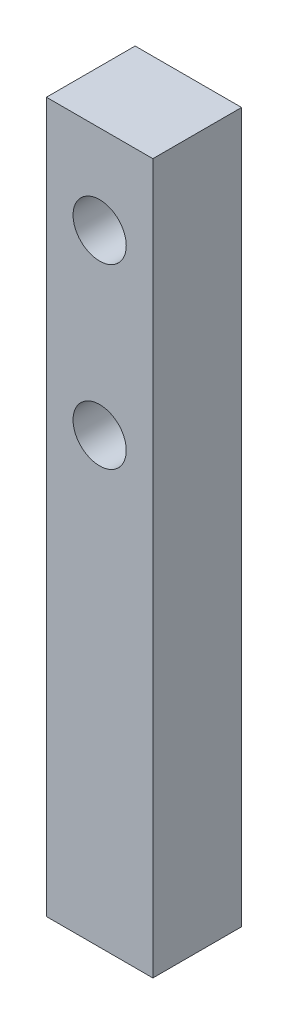
ISO-10303-21;
HEADER;
FILE_DESCRIPTION(('STEP AP214'),'2;1');
FILE_NAME('part.step','',(''),(''),'','','');
FILE_SCHEMA(('AUTOMOTIVE_DESIGN { 1 0 10303 214 1 1 1 1 }'));
ENDSEC;
DATA;
#1=APPLICATION_CONTEXT('core data for automotive mechanical design processes');
#2=APPLICATION_PROTOCOL_DEFINITION('international standard','automotive_design',2000,#1);
#3=PRODUCT_CONTEXT('',#1,'mechanical');
#4=PRODUCT('Part','Part','',(#3));
#5=PRODUCT_RELATED_PRODUCT_CATEGORY('part','',(#4));
#6=PRODUCT_DEFINITION_FORMATION('','',#4);
#7=PRODUCT_DEFINITION_CONTEXT('part definition',#1,'design');
#8=PRODUCT_DEFINITION('design','',#6,#7);
#9=PRODUCT_DEFINITION_SHAPE('','',#8);
#10=(LENGTH_UNIT() NAMED_UNIT(*) SI_UNIT(.MILLI.,.METRE.));
#11=(NAMED_UNIT(*) PLANE_ANGLE_UNIT() SI_UNIT($,.RADIAN.));
#12=(NAMED_UNIT(*) SI_UNIT($,.STERADIAN.) SOLID_ANGLE_UNIT());
#13=UNCERTAINTY_MEASURE_WITH_UNIT(LENGTH_MEASURE(1.E-05),#10,'distance_accuracy_value','');
#14=(GEOMETRIC_REPRESENTATION_CONTEXT(3) GLOBAL_UNCERTAINTY_ASSIGNED_CONTEXT((#13)) GLOBAL_UNIT_ASSIGNED_CONTEXT((#10,
#11,#12)) REPRESENTATION_CONTEXT('',''));
#15=CARTESIAN_POINT('',(0.,0.,0.));
#16=DIRECTION('',(0.,0.,1.));
#17=DIRECTION('',(1.,0.,0.));
#18=AXIS2_PLACEMENT_3D('',#15,#16,#17);
#19=CARTESIAN_POINT('',(0.,0.,6.35));
#20=DIRECTION('',(0.,0.,-1.));
#21=DIRECTION('',(-1.,0.,0.));
#22=AXIS2_PLACEMENT_3D('',#19,#20,#21);
#23=PLANE('',#22);
#24=DIRECTION('',(0.,-1.,0.));
#25=VECTOR('',#24,1.);
#26=CARTESIAN_POINT('',(0.,0.,6.35));
#27=LINE('',#26,#25);
#28=CARTESIAN_POINT('',(0.,50.8,6.35));
#29=VERTEX_POINT('',#28);
#30=CARTESIAN_POINT('',(0.,0.,6.35));
#31=VERTEX_POINT('',#30);
#32=EDGE_CURVE('E88',#29,#31,#27,.T.);
#33=ORIENTED_EDGE('',*,*,#32,.T.);
#34=DIRECTION('',(1.,0.,0.));
#35=VECTOR('',#34,1.);
#36=CARTESIAN_POINT('',(0.,0.,6.35));
#37=LINE('',#36,#35);
#38=CARTESIAN_POINT('',(7.62,0.,6.35));
#39=VERTEX_POINT('',#38);
#40=EDGE_CURVE('E83',#31,#39,#37,.T.);
#41=ORIENTED_EDGE('',*,*,#40,.T.);
#42=DIRECTION('',(0.,1.,0.));
#43=VECTOR('',#42,1.);
#44=CARTESIAN_POINT('',(7.62,0.,6.35));
#45=LINE('',#44,#43);
#46=CARTESIAN_POINT('',(7.62,50.8,6.35));
#47=VERTEX_POINT('',#46);
#48=EDGE_CURVE('E86',#39,#47,#45,.T.);
#49=ORIENTED_EDGE('',*,*,#48,.T.);
#50=DIRECTION('',(-1.,0.,0.));
#51=VECTOR('',#50,1.);
#52=CARTESIAN_POINT('',(0.,50.8,6.35));
#53=LINE('',#52,#51);
#54=EDGE_CURVE('E53',#47,#29,#53,.T.);
#55=ORIENTED_EDGE('',*,*,#54,.T.);
#56=EDGE_LOOP('',(#33,#41,#49,#55));
#57=FACE_BOUND('',#56,.T.);
#58=CARTESIAN_POINT('',(3.81,44.45,6.35));
#59=DIRECTION('',(0.,0.,1.));
#60=DIRECTION('',(1.,0.,0.));
#61=AXIS2_PLACEMENT_3D('',#58,#59,#60);
#62=CIRCLE('',#61,1.905);
#63=CARTESIAN_POINT('',(5.715,44.45,6.35));
#64=VERTEX_POINT('',#63);
#65=EDGE_CURVE('E103',#64,#64,#62,.T.);
#66=ORIENTED_EDGE('',*,*,#65,.F.);
#67=EDGE_LOOP('',(#66));
#68=FACE_BOUND('',#67,.T.);
#69=CARTESIAN_POINT('',(3.81,31.75,6.35));
#70=DIRECTION('',(0.,0.,1.));
#71=DIRECTION('',(1.,0.,0.));
#72=AXIS2_PLACEMENT_3D('',#69,#70,#71);
#73=CIRCLE('',#72,1.905);
#74=CARTESIAN_POINT('',(5.715,31.75,6.35));
#75=VERTEX_POINT('',#74);
#76=EDGE_CURVE('E118',#75,#75,#73,.T.);
#77=ORIENTED_EDGE('',*,*,#76,.F.);
#78=EDGE_LOOP('',(#77));
#79=FACE_BOUND('',#78,.T.);
#80=ADVANCED_FACE('F36',(#57,#68,#79),#23,.F.);
#81=CARTESIAN_POINT('',(0.,0.,0.));
#82=DIRECTION('',(0.,0.,-1.));
#83=DIRECTION('',(-1.,0.,0.));
#84=AXIS2_PLACEMENT_3D('',#81,#82,#83);
#85=PLANE('',#84);
#86=CARTESIAN_POINT('',(3.81,44.45,0.));
#87=DIRECTION('',(0.,0.,1.));
#88=DIRECTION('',(1.,0.,0.));
#89=AXIS2_PLACEMENT_3D('',#86,#87,#88);
#90=CIRCLE('',#89,1.905);
#91=CARTESIAN_POINT('',(5.715,44.45,0.));
#92=VERTEX_POINT('',#91);
#93=EDGE_CURVE('E115',#92,#92,#90,.T.);
#94=ORIENTED_EDGE('',*,*,#93,.T.);
#95=EDGE_LOOP('',(#94));
#96=FACE_BOUND('',#95,.T.);
#97=DIRECTION('',(0.,-1.,0.));
#98=VECTOR('',#97,1.);
#99=CARTESIAN_POINT('',(0.,0.,0.));
#100=LINE('',#99,#98);
#101=CARTESIAN_POINT('',(0.,50.8,0.));
#102=VERTEX_POINT('',#101);
#103=CARTESIAN_POINT('',(0.,0.,0.));
#104=VERTEX_POINT('',#103);
#105=EDGE_CURVE('E100',#102,#104,#100,.T.);
#106=ORIENTED_EDGE('',*,*,#105,.F.);
#107=DIRECTION('',(-1.,0.,0.));
#108=VECTOR('',#107,1.);
#109=CARTESIAN_POINT('',(0.,50.8,0.));
#110=LINE('',#109,#108);
#111=CARTESIAN_POINT('',(7.62,50.8,0.));
#112=VERTEX_POINT('',#111);
#113=EDGE_CURVE('E76',#112,#102,#110,.T.);
#114=ORIENTED_EDGE('',*,*,#113,.F.);
#115=DIRECTION('',(0.,1.,0.));
#116=VECTOR('',#115,1.);
#117=CARTESIAN_POINT('',(7.62,0.,0.));
#118=LINE('',#117,#116);
#119=CARTESIAN_POINT('',(7.62,0.,0.));
#120=VERTEX_POINT('',#119);
#121=EDGE_CURVE('E70',#120,#112,#118,.T.);
#122=ORIENTED_EDGE('',*,*,#121,.F.);
#123=DIRECTION('',(1.,0.,0.));
#124=VECTOR('',#123,1.);
#125=CARTESIAN_POINT('',(0.,0.,0.));
#126=LINE('',#125,#124);
#127=EDGE_CURVE('E92',#104,#120,#126,.T.);
#128=ORIENTED_EDGE('',*,*,#127,.F.);
#129=EDGE_LOOP('',(#106,#114,#122,#128));
#130=FACE_BOUND('',#129,.T.);
#131=CARTESIAN_POINT('',(3.81,31.75,0.));
#132=DIRECTION('',(0.,0.,1.));
#133=DIRECTION('',(1.,0.,0.));
#134=AXIS2_PLACEMENT_3D('',#131,#132,#133);
#135=CIRCLE('',#134,1.905);
#136=CARTESIAN_POINT('',(5.715,31.75,0.));
#137=VERTEX_POINT('',#136);
#138=EDGE_CURVE('E121',#137,#137,#135,.T.);
#139=ORIENTED_EDGE('',*,*,#138,.T.);
#140=EDGE_LOOP('',(#139));
#141=FACE_BOUND('',#140,.T.);
#142=ADVANCED_FACE('F111',(#96,#130,#141),#85,.T.);
#143=CARTESIAN_POINT('',(0.,0.,6.35));
#144=DIRECTION('',(1.,0.,0.));
#145=DIRECTION('',(0.,0.,-1.));
#146=AXIS2_PLACEMENT_3D('',#143,#144,#145);
#147=PLANE('',#146);
#148=ORIENTED_EDGE('',*,*,#105,.T.);
#149=DIRECTION('',(0.,0.,-1.));
#150=VECTOR('',#149,1.);
#151=CARTESIAN_POINT('',(0.,0.,6.35));
#152=LINE('',#151,#150);
#153=EDGE_CURVE('E11',#31,#104,#152,.T.);
#154=ORIENTED_EDGE('',*,*,#153,.F.);
#155=ORIENTED_EDGE('',*,*,#32,.F.);
#156=DIRECTION('',(0.,0.,-1.));
#157=VECTOR('',#156,1.);
#158=CARTESIAN_POINT('',(0.,50.8,6.35));
#159=LINE('',#158,#157);
#160=EDGE_CURVE('E96',#29,#102,#159,.T.);
#161=ORIENTED_EDGE('',*,*,#160,.T.);
#162=EDGE_LOOP('',(#148,#154,#155,#161));
#163=FACE_BOUND('',#162,.T.);
#164=ADVANCED_FACE('F38',(#163),#147,.F.);
#165=CARTESIAN_POINT('',(0.,0.,6.35));
#166=DIRECTION('',(0.,1.,0.));
#167=DIRECTION('',(0.,0.,1.));
#168=AXIS2_PLACEMENT_3D('',#165,#166,#167);
#169=PLANE('',#168);
#170=ORIENTED_EDGE('',*,*,#127,.T.);
#171=DIRECTION('',(0.,0.,-1.));
#172=VECTOR('',#171,1.);
#173=CARTESIAN_POINT('',(7.62,0.,6.35));
#174=LINE('',#173,#172);
#175=EDGE_CURVE('E45',#39,#120,#174,.T.);
#176=ORIENTED_EDGE('',*,*,#175,.F.);
#177=ORIENTED_EDGE('',*,*,#40,.F.);
#178=ORIENTED_EDGE('',*,*,#153,.T.);
#179=EDGE_LOOP('',(#170,#176,#177,#178));
#180=FACE_BOUND('',#179,.T.);
#181=ADVANCED_FACE('F91',(#180),#169,.F.);
#182=CARTESIAN_POINT('',(7.62,0.,6.35));
#183=DIRECTION('',(-1.,0.,0.));
#184=DIRECTION('',(0.,0.,1.));
#185=AXIS2_PLACEMENT_3D('',#182,#183,#184);
#186=PLANE('',#185);
#187=ORIENTED_EDGE('',*,*,#121,.T.);
#188=DIRECTION('',(0.,0.,-1.));
#189=VECTOR('',#188,1.);
#190=CARTESIAN_POINT('',(7.62,50.8,6.35));
#191=LINE('',#190,#189);
#192=EDGE_CURVE('E93',#47,#112,#191,.T.);
#193=ORIENTED_EDGE('',*,*,#192,.F.);
#194=ORIENTED_EDGE('',*,*,#48,.F.);
#195=ORIENTED_EDGE('',*,*,#175,.T.);
#196=EDGE_LOOP('',(#187,#193,#194,#195));
#197=FACE_BOUND('',#196,.T.);
#198=ADVANCED_FACE('F94',(#197),#186,.F.);
#199=CARTESIAN_POINT('',(0.,50.8,6.35));
#200=DIRECTION('',(0.,-1.,0.));
#201=DIRECTION('',(0.,0.,-1.));
#202=AXIS2_PLACEMENT_3D('',#199,#200,#201);
#203=PLANE('',#202);
#204=ORIENTED_EDGE('',*,*,#113,.T.);
#205=ORIENTED_EDGE('',*,*,#160,.F.);
#206=ORIENTED_EDGE('',*,*,#54,.F.);
#207=ORIENTED_EDGE('',*,*,#192,.T.);
#208=EDGE_LOOP('',(#204,#205,#206,#207));
#209=FACE_BOUND('',#208,.T.);
#210=ADVANCED_FACE('F108',(#209),#203,.F.);
#211=CARTESIAN_POINT('',(3.81,44.45,6.35));
#212=DIRECTION('',(0.,0.,-1.));
#213=DIRECTION('',(-1.,0.,0.));
#214=AXIS2_PLACEMENT_3D('',#211,#212,#213);
#215=CYLINDRICAL_SURFACE('',#214,1.905);
#216=ORIENTED_EDGE('',*,*,#65,.T.);
#217=EDGE_LOOP('',(#216));
#218=FACE_BOUND('',#217,.T.);
#219=ORIENTED_EDGE('',*,*,#93,.F.);
#220=EDGE_LOOP('',(#219));
#221=FACE_BOUND('',#220,.T.);
#222=ADVANCED_FACE('F138',(#218,#221),#215,.F.);
#223=CARTESIAN_POINT('',(3.81,31.75,6.35));
#224=DIRECTION('',(0.,0.,-1.));
#225=DIRECTION('',(-1.,0.,0.));
#226=AXIS2_PLACEMENT_3D('',#223,#224,#225);
#227=CYLINDRICAL_SURFACE('',#226,1.905);
#228=ORIENTED_EDGE('',*,*,#76,.T.);
#229=EDGE_LOOP('',(#228));
#230=FACE_BOUND('',#229,.T.);
#231=ORIENTED_EDGE('',*,*,#138,.F.);
#232=EDGE_LOOP('',(#231));
#233=FACE_BOUND('',#232,.T.);
#234=ADVANCED_FACE('F127',(#230,#233),#227,.F.);
#235=CLOSED_SHELL('',(#80,#142,#164,#181,#198,#210,#222,#234));
#236=MANIFOLD_SOLID_BREP('B2',#235);
#237=ADVANCED_BREP_SHAPE_REPRESENTATION('',(#18,#236),#14);
#238=SHAPE_DEFINITION_REPRESENTATION(#9,#237);
ENDSEC;
END-ISO-10303-21;
